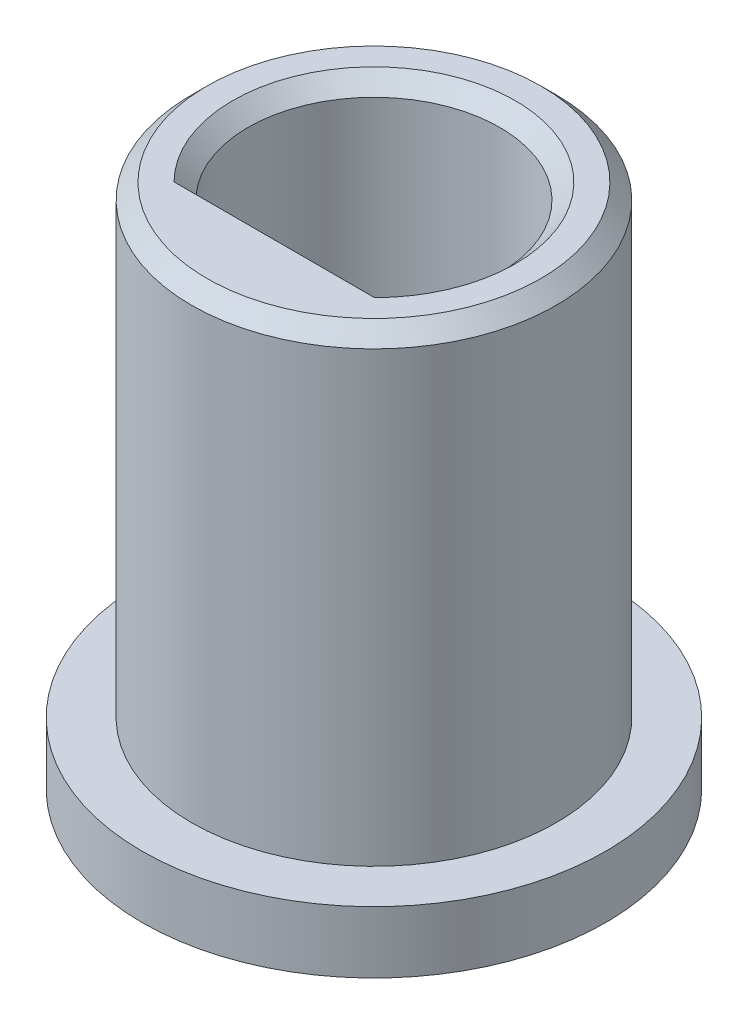
ISO-10303-21;
HEADER;
FILE_DESCRIPTION(('STEP AP214'),'2;1');
FILE_NAME('part.step','',(''),(''),'','','');
FILE_SCHEMA(('AUTOMOTIVE_DESIGN { 1 0 10303 214 1 1 1 1 }'));
ENDSEC;
DATA;
#1=APPLICATION_CONTEXT('core data for automotive mechanical design processes');
#2=APPLICATION_PROTOCOL_DEFINITION('international standard','automotive_design',2000,#1);
#3=PRODUCT_CONTEXT('',#1,'mechanical');
#4=PRODUCT('Part','Part','',(#3));
#5=PRODUCT_RELATED_PRODUCT_CATEGORY('part','',(#4));
#6=PRODUCT_DEFINITION_FORMATION('','',#4);
#7=PRODUCT_DEFINITION_CONTEXT('part definition',#1,'design');
#8=PRODUCT_DEFINITION('design','',#6,#7);
#9=PRODUCT_DEFINITION_SHAPE('','',#8);
#10=(LENGTH_UNIT() NAMED_UNIT(*) SI_UNIT(.MILLI.,.METRE.));
#11=(NAMED_UNIT(*) PLANE_ANGLE_UNIT() SI_UNIT($,.RADIAN.));
#12=(NAMED_UNIT(*) SI_UNIT($,.STERADIAN.) SOLID_ANGLE_UNIT());
#13=UNCERTAINTY_MEASURE_WITH_UNIT(LENGTH_MEASURE(1.E-05),#10,'distance_accuracy_value','');
#14=(GEOMETRIC_REPRESENTATION_CONTEXT(3) GLOBAL_UNCERTAINTY_ASSIGNED_CONTEXT((#13)) GLOBAL_UNIT_ASSIGNED_CONTEXT((#10,
#11,#12)) REPRESENTATION_CONTEXT('',''));
#15=CARTESIAN_POINT('',(0.,0.,0.));
#16=DIRECTION('',(0.,0.,1.));
#17=DIRECTION('',(1.,0.,0.));
#18=AXIS2_PLACEMENT_3D('',#15,#16,#17);
#19=CARTESIAN_POINT('',(0.,0.,0.));
#20=DIRECTION('',(0.,1.,0.));
#21=DIRECTION('',(0.,0.,1.));
#22=AXIS2_PLACEMENT_3D('',#19,#20,#21);
#23=PLANE('',#22);
#24=DIRECTION('',(1.,0.,0.));
#25=VECTOR('',#24,1.);
#26=CARTESIAN_POINT('',(-3.02985148150862,0.,2.725));
#27=LINE('',#26,#25);
#28=CARTESIAN_POINT('',(-3.02985148150862,0.,2.725));
#29=VERTEX_POINT('',#28);
#30=CARTESIAN_POINT('',(3.02985148150862,0.,2.725));
#31=VERTEX_POINT('',#30);
#32=EDGE_CURVE('E91',#29,#31,#27,.T.);
#33=ORIENTED_EDGE('',*,*,#32,.T.);
#34=CARTESIAN_POINT('',(0.,0.,0.));
#35=DIRECTION('',(0.,1.,0.));
#36=DIRECTION('',(0.,0.,1.));
#37=AXIS2_PLACEMENT_3D('',#34,#35,#36);
#38=CIRCLE('',#37,4.075);
#39=EDGE_CURVE('E87',#31,#29,#38,.T.);
#40=ORIENTED_EDGE('',*,*,#39,.T.);
#41=EDGE_LOOP('',(#33,#40));
#42=FACE_BOUND('',#41,.T.);
#43=CARTESIAN_POINT('',(0.,0.,0.));
#44=DIRECTION('',(0.,1.,0.));
#45=DIRECTION('',(0.,0.,1.));
#46=AXIS2_PLACEMENT_3D('',#43,#44,#45);
#47=CIRCLE('',#46,7.5);
#48=CARTESIAN_POINT('',(0.,0.,7.5));
#49=VERTEX_POINT('',#48);
#50=EDGE_CURVE('E108',#49,#49,#47,.T.);
#51=ORIENTED_EDGE('',*,*,#50,.F.);
#52=EDGE_LOOP('',(#51));
#53=FACE_BOUND('',#52,.T.);
#54=ADVANCED_FACE('F43',(#42,#53),#23,.F.);
#55=CARTESIAN_POINT('',(0.,0.,0.));
#56=DIRECTION('',(0.,1.,0.));
#57=DIRECTION('',(0.,0.,1.));
#58=AXIS2_PLACEMENT_3D('',#55,#56,#57);
#59=CYLINDRICAL_SURFACE('',#58,7.5);
#60=CARTESIAN_POINT('',(0.,2.,0.));
#61=DIRECTION('',(0.,1.,0.));
#62=DIRECTION('',(0.,0.,1.));
#63=AXIS2_PLACEMENT_3D('',#60,#61,#62);
#64=CIRCLE('',#63,7.5);
#65=CARTESIAN_POINT('',(0.,2.,7.5));
#66=VERTEX_POINT('',#65);
#67=EDGE_CURVE('E106',#66,#66,#64,.T.);
#68=ORIENTED_EDGE('',*,*,#67,.F.);
#69=EDGE_LOOP('',(#68));
#70=FACE_BOUND('',#69,.T.);
#71=ORIENTED_EDGE('',*,*,#50,.T.);
#72=EDGE_LOOP('',(#71));
#73=FACE_BOUND('',#72,.T.);
#74=ADVANCED_FACE('F145',(#70,#73),#59,.T.);
#75=CARTESIAN_POINT('',(7.5,2.,0.));
#76=DIRECTION('',(0.,-1.,0.));
#77=DIRECTION('',(0.,0.,-1.));
#78=AXIS2_PLACEMENT_3D('',#75,#76,#77);
#79=PLANE('',#78);
#80=CARTESIAN_POINT('',(0.,2.,0.));
#81=DIRECTION('',(0.,1.,0.));
#82=DIRECTION('',(0.,0.,1.));
#83=AXIS2_PLACEMENT_3D('',#80,#81,#82);
#84=CIRCLE('',#83,5.9);
#85=CARTESIAN_POINT('',(0.,2.,5.9));
#86=VERTEX_POINT('',#85);
#87=EDGE_CURVE('E105',#86,#86,#84,.T.);
#88=ORIENTED_EDGE('',*,*,#87,.F.);
#89=EDGE_LOOP('',(#88));
#90=FACE_BOUND('',#89,.T.);
#91=ORIENTED_EDGE('',*,*,#67,.T.);
#92=EDGE_LOOP('',(#91));
#93=FACE_BOUND('',#92,.T.);
#94=ADVANCED_FACE('F150',(#90,#93),#79,.F.);
#95=CARTESIAN_POINT('',(0.,0.,0.));
#96=DIRECTION('',(0.,1.,0.));
#97=DIRECTION('',(0.,0.,1.));
#98=AXIS2_PLACEMENT_3D('',#95,#96,#97);
#99=CYLINDRICAL_SURFACE('',#98,5.9);
#100=CARTESIAN_POINT('',(0.,16.5,0.));
#101=DIRECTION('',(0.,-1.,0.));
#102=DIRECTION('',(0.,0.,-1.));
#103=AXIS2_PLACEMENT_3D('',#100,#101,#102);
#104=CIRCLE('',#103,5.9);
#105=CARTESIAN_POINT('',(0.,16.5,-5.9));
#106=VERTEX_POINT('',#105);
#107=EDGE_CURVE('E117',#106,#106,#104,.T.);
#108=ORIENTED_EDGE('',*,*,#107,.T.);
#109=EDGE_LOOP('',(#108));
#110=FACE_BOUND('',#109,.T.);
#111=ORIENTED_EDGE('',*,*,#87,.T.);
#112=EDGE_LOOP('',(#111));
#113=FACE_BOUND('',#112,.T.);
#114=ADVANCED_FACE('F151',(#110,#113),#99,.T.);
#115=CARTESIAN_POINT('',(5.9,17.,0.));
#116=DIRECTION('',(0.,-1.,0.));
#117=DIRECTION('',(0.,0.,-1.));
#118=AXIS2_PLACEMENT_3D('',#115,#116,#117);
#119=PLANE('',#118);
#120=CARTESIAN_POINT('',(0.,17.,0.));
#121=DIRECTION('',(0.,-1.,0.));
#122=DIRECTION('',(0.,0.,-1.));
#123=AXIS2_PLACEMENT_3D('',#120,#121,#122);
#124=CIRCLE('',#123,5.40000000000001);
#125=CARTESIAN_POINT('',(0.,17.,-5.40000000000001));
#126=VERTEX_POINT('',#125);
#127=EDGE_CURVE('E120',#126,#126,#124,.F.);
#128=ORIENTED_EDGE('',*,*,#127,.T.);
#129=EDGE_LOOP('',(#128));
#130=FACE_BOUND('',#129,.T.);
#131=CARTESIAN_POINT('',(0.,17.,0.));
#132=DIRECTION('',(0.,-1.,0.));
#133=DIRECTION('',(0.,0.,-1.));
#134=AXIS2_PLACEMENT_3D('',#131,#132,#133);
#135=CIRCLE('',#134,4.575);
#136=CARTESIAN_POINT('',(-3.24499614791835,17.,3.22499999999924));
#137=VERTEX_POINT('',#136);
#138=CARTESIAN_POINT('',(3.24499614791835,17.,3.22499999999924));
#139=VERTEX_POINT('',#138);
#140=EDGE_CURVE('E115',#137,#139,#135,.T.);
#141=ORIENTED_EDGE('',*,*,#140,.T.);
#142=DIRECTION('',(-1.,0.,0.));
#143=VECTOR('',#142,1.);
#144=CARTESIAN_POINT('',(5.9,17.,3.225));
#145=LINE('',#144,#143);
#146=EDGE_CURVE('E111',#139,#137,#145,.T.);
#147=ORIENTED_EDGE('',*,*,#146,.T.);
#148=EDGE_LOOP('',(#141,#147));
#149=FACE_BOUND('',#148,.T.);
#150=ADVANCED_FACE('F154',(#130,#149),#119,.F.);
#151=CARTESIAN_POINT('',(0.,0.,0.));
#152=DIRECTION('',(0.,1.,0.));
#153=DIRECTION('',(0.,0.,1.));
#154=AXIS2_PLACEMENT_3D('',#151,#152,#153);
#155=CYLINDRICAL_SURFACE('',#154,4.075);
#156=DIRECTION('',(0.,1.,0.));
#157=VECTOR('',#156,1.);
#158=CARTESIAN_POINT('',(3.02985148150862,0.,2.725));
#159=LINE('',#158,#157);
#160=CARTESIAN_POINT('',(3.02985148150862,16.5,2.725));
#161=VERTEX_POINT('',#160);
#162=EDGE_CURVE('E95',#31,#161,#159,.T.);
#163=ORIENTED_EDGE('',*,*,#162,.T.);
#164=CARTESIAN_POINT('',(0.,16.5,0.));
#165=DIRECTION('',(0.,-1.,0.));
#166=DIRECTION('',(0.,0.,-1.));
#167=AXIS2_PLACEMENT_3D('',#164,#165,#166);
#168=CIRCLE('',#167,4.075);
#169=CARTESIAN_POINT('',(-3.02985148150862,16.5,2.725));
#170=VERTEX_POINT('',#169);
#171=EDGE_CURVE('E11',#161,#170,#168,.F.);
#172=ORIENTED_EDGE('',*,*,#171,.T.);
#173=DIRECTION('',(0.,1.,0.));
#174=VECTOR('',#173,1.);
#175=CARTESIAN_POINT('',(-3.02985148150862,0.,2.725));
#176=LINE('',#175,#174);
#177=EDGE_CURVE('E81',#29,#170,#176,.T.);
#178=ORIENTED_EDGE('',*,*,#177,.F.);
#179=ORIENTED_EDGE('',*,*,#39,.F.);
#180=EDGE_LOOP('',(#163,#172,#178,#179));
#181=FACE_BOUND('',#180,.T.);
#182=ADVANCED_FACE('F84',(#181),#155,.F.);
#183=CARTESIAN_POINT('',(-3.02985148150862,0.,2.725));
#184=DIRECTION('',(0.,0.,1.));
#185=DIRECTION('',(1.,0.,0.));
#186=AXIS2_PLACEMENT_3D('',#183,#184,#185);
#187=PLANE('',#186);
#188=ORIENTED_EDGE('',*,*,#177,.T.);
#189=DIRECTION('',(1.,0.,0.));
#190=VECTOR('',#189,1.);
#191=CARTESIAN_POINT('',(-3.02985148150862,16.5,2.725));
#192=LINE('',#191,#190);
#193=EDGE_CURVE('E59',#170,#161,#192,.T.);
#194=ORIENTED_EDGE('',*,*,#193,.T.);
#195=ORIENTED_EDGE('',*,*,#162,.F.);
#196=ORIENTED_EDGE('',*,*,#32,.F.);
#197=EDGE_LOOP('',(#188,#194,#195,#196));
#198=FACE_BOUND('',#197,.T.);
#199=ADVANCED_FACE('F96',(#198),#187,.F.);
#200=CARTESIAN_POINT('',(0.,17.,0.));
#201=DIRECTION('',(0.,-1.,0.));
#202=DIRECTION('',(0.,0.,-1.));
#203=AXIS2_PLACEMENT_3D('',#200,#201,#202);
#204=CONICAL_SURFACE('',#203,5.40000000000001,0.785398163397444);
#205=ORIENTED_EDGE('',*,*,#107,.F.);
#206=EDGE_LOOP('',(#205));
#207=FACE_BOUND('',#206,.T.);
#208=ORIENTED_EDGE('',*,*,#127,.F.);
#209=EDGE_LOOP('',(#208));
#210=FACE_BOUND('',#209,.T.);
#211=ADVANCED_FACE('F132',(#207,#210),#204,.T.);
#212=CARTESIAN_POINT('',(0.,16.5,0.));
#213=DIRECTION('',(0.,1.,0.));
#214=DIRECTION('',(0.,0.,1.));
#215=AXIS2_PLACEMENT_3D('',#212,#213,#214);
#216=CONICAL_SURFACE('',#215,4.075,0.785398163397453);
#217=CARTESIAN_POINT('',(3.02985148150862,16.5,2.725));
#218=CARTESIAN_POINT('',(3.06683396496444,16.5830914071448,2.80809140714484));
#219=CARTESIAN_POINT('',(3.10325395177357,16.6663038324404,2.89130383244035));
#220=CARTESIAN_POINT('',(3.17496883761219,16.8329704997449,3.05797049974489));
#221=CARTESIAN_POINT('',(3.21026373960609,16.9164247411162,3.14142474111615));
#222=CARTESIAN_POINT('',(3.24499614791772,17.0000000000003,3.22500000000031));
#223=B_SPLINE_CURVE_WITH_KNOTS('',3,(#217,#218,#219,#220,#221,#222),.UNSPECIFIED.,.F.,.F.,(4,2,
4),(0.,0.369560925933317,0.739120878054988),.UNSPECIFIED.);
#224=EDGE_CURVE('E75',#139,#161,#223,.F.);
#225=ORIENTED_EDGE('',*,*,#224,.F.);
#226=ORIENTED_EDGE('',*,*,#140,.F.);
#227=CARTESIAN_POINT('',(-3.24499614791911,17.,3.225));
#228=CARTESIAN_POINT('',(-3.21026373960646,16.9164247411161,3.14142474111607));
#229=CARTESIAN_POINT('',(-3.1749688376121,16.8329704997449,3.05797049974491));
#230=CARTESIAN_POINT('',(-3.10325395177367,16.6663038324403,2.89130383244033));
#231=CARTESIAN_POINT('',(-3.0668339649652,16.5830914071447,2.80809140714468));
#232=CARTESIAN_POINT('',(-3.0298514815106,16.4999999999996,2.72499999999959));
#233=B_SPLINE_CURVE_WITH_KNOTS('',3,(#227,#228,#229,#230,#231,#232),.UNSPECIFIED.,.F.,.F.,(4,2,
4),(0.,0.369559952121646,0.73912087805494),.UNSPECIFIED.);
#234=EDGE_CURVE('E47',#170,#137,#233,.F.);
#235=ORIENTED_EDGE('',*,*,#234,.F.);
#236=ORIENTED_EDGE('',*,*,#171,.F.);
#237=EDGE_LOOP('',(#225,#226,#235,#236));
#238=FACE_BOUND('',#237,.T.);
#239=ADVANCED_FACE('F46',(#238),#216,.F.);
#240=CARTESIAN_POINT('',(-3.02985148150862,16.5,2.725));
#241=DIRECTION('',(0.,-0.707106781186551,0.707106781186544));
#242=DIRECTION('',(1.,0.,0.));
#243=AXIS2_PLACEMENT_3D('',#240,#241,#242);
#244=PLANE('',#243);
#245=ORIENTED_EDGE('',*,*,#234,.T.);
#246=ORIENTED_EDGE('',*,*,#146,.F.);
#247=ORIENTED_EDGE('',*,*,#224,.T.);
#248=ORIENTED_EDGE('',*,*,#193,.F.);
#249=EDGE_LOOP('',(#245,#246,#247,#248));
#250=FACE_BOUND('',#249,.T.);
#251=ADVANCED_FACE('F126',(#250),#244,.F.);
#252=CLOSED_SHELL('',(#54,#74,#94,#114,#150,#182,#199,#211,#239,#251));
#253=MANIFOLD_SOLID_BREP('B2',#252);
#254=ADVANCED_BREP_SHAPE_REPRESENTATION('',(#18,#253),#14);
#255=SHAPE_DEFINITION_REPRESENTATION(#9,#254);
ENDSEC;
END-ISO-10303-21;
